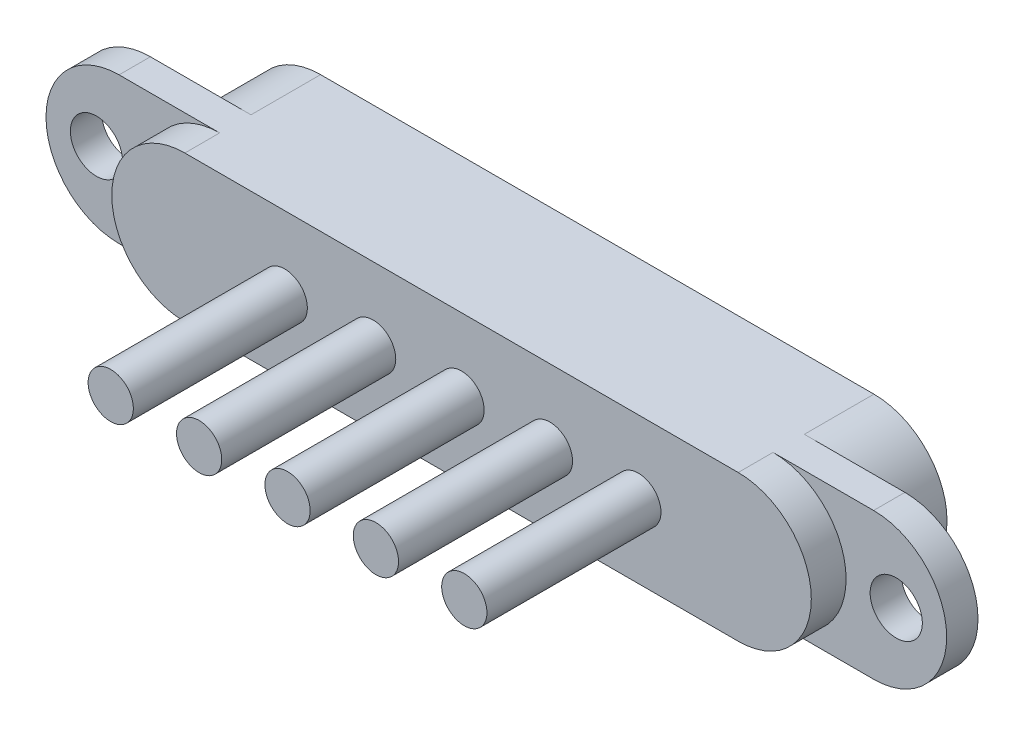
ISO-10303-21;
HEADER;
FILE_DESCRIPTION(('STEP AP214'),'2;1');
FILE_NAME('part.step','',(''),(''),'','','');
FILE_SCHEMA(('AUTOMOTIVE_DESIGN { 1 0 10303 214 1 1 1 1 }'));
ENDSEC;
DATA;
#1=APPLICATION_CONTEXT('core data for automotive mechanical design processes');
#2=APPLICATION_PROTOCOL_DEFINITION('international standard','automotive_design',2000,#1);
#3=PRODUCT_CONTEXT('',#1,'mechanical');
#4=PRODUCT('Part','Part','',(#3));
#5=PRODUCT_RELATED_PRODUCT_CATEGORY('part','',(#4));
#6=PRODUCT_DEFINITION_FORMATION('','',#4);
#7=PRODUCT_DEFINITION_CONTEXT('part definition',#1,'design');
#8=PRODUCT_DEFINITION('design','',#6,#7);
#9=PRODUCT_DEFINITION_SHAPE('','',#8);
#10=(LENGTH_UNIT() NAMED_UNIT(*) SI_UNIT(.MILLI.,.METRE.));
#11=(NAMED_UNIT(*) PLANE_ANGLE_UNIT() SI_UNIT($,.RADIAN.));
#12=(NAMED_UNIT(*) SI_UNIT($,.STERADIAN.) SOLID_ANGLE_UNIT());
#13=UNCERTAINTY_MEASURE_WITH_UNIT(LENGTH_MEASURE(1.E-05),#10,'distance_accuracy_value','');
#14=(GEOMETRIC_REPRESENTATION_CONTEXT(3) GLOBAL_UNCERTAINTY_ASSIGNED_CONTEXT((#13)) GLOBAL_UNIT_ASSIGNED_CONTEXT((#10,
#11,#12)) REPRESENTATION_CONTEXT('',''));
#15=CARTESIAN_POINT('',(0.,0.,0.));
#16=DIRECTION('',(0.,0.,1.));
#17=DIRECTION('',(1.,0.,0.));
#18=AXIS2_PLACEMENT_3D('',#15,#16,#17);
#19=CARTESIAN_POINT('',(-10.84,0.,2.9));
#20=DIRECTION('',(0.,0.,1.));
#21=DIRECTION('',(1.,0.,0.));
#22=AXIS2_PLACEMENT_3D('',#19,#20,#21);
#23=PLANE('',#22);
#24=CARTESIAN_POINT('',(-7.95,0.,2.9));
#25=DIRECTION('',(0.,0.,1.));
#26=DIRECTION('',(1.,0.,0.));
#27=AXIS2_PLACEMENT_3D('',#24,#25,#26);
#28=CIRCLE('',#27,2.1);
#29=CARTESIAN_POINT('',(-7.95,2.1,2.9));
#30=VERTEX_POINT('',#29);
#31=CARTESIAN_POINT('',(-7.95,-2.1,2.9));
#32=VERTEX_POINT('',#31);
#33=EDGE_CURVE('E58',#30,#32,#28,.T.);
#34=ORIENTED_EDGE('',*,*,#33,.F.);
#35=DIRECTION('',(-1.,0.,0.));
#36=VECTOR('',#35,1.);
#37=CARTESIAN_POINT('',(-10.84,2.1,2.9));
#38=LINE('',#37,#36);
#39=CARTESIAN_POINT('',(-10.84,2.1,2.9));
#40=VERTEX_POINT('',#39);
#41=EDGE_CURVE('E238',#30,#40,#38,.T.);
#42=ORIENTED_EDGE('',*,*,#41,.T.);
#43=CARTESIAN_POINT('',(-10.84,0.,2.9));
#44=DIRECTION('',(0.,0.,1.));
#45=DIRECTION('',(1.,0.,0.));
#46=AXIS2_PLACEMENT_3D('',#43,#44,#45);
#47=CIRCLE('',#46,2.1);
#48=CARTESIAN_POINT('',(-10.84,-2.1,2.9));
#49=VERTEX_POINT('',#48);
#50=EDGE_CURVE('E232',#40,#49,#47,.T.);
#51=ORIENTED_EDGE('',*,*,#50,.T.);
#52=DIRECTION('',(1.,0.,0.));
#53=VECTOR('',#52,1.);
#54=CARTESIAN_POINT('',(-10.84,-2.1,2.9));
#55=LINE('',#54,#53);
#56=EDGE_CURVE('E237',#49,#32,#55,.T.);
#57=ORIENTED_EDGE('',*,*,#56,.T.);
#58=EDGE_LOOP('',(#34,#42,#51,#57));
#59=FACE_BOUND('',#58,.T.);
#60=CARTESIAN_POINT('',(-11.49,0.,2.9));
#61=DIRECTION('',(0.,0.,-1.));
#62=DIRECTION('',(-1.,0.,0.));
#63=AXIS2_PLACEMENT_3D('',#60,#61,#62);
#64=CIRCLE('',#63,0.75);
#65=CARTESIAN_POINT('',(-12.24,0.,2.9));
#66=VERTEX_POINT('',#65);
#67=EDGE_CURVE('E214',#66,#66,#64,.T.);
#68=ORIENTED_EDGE('',*,*,#67,.T.);
#69=EDGE_LOOP('',(#68));
#70=FACE_BOUND('',#69,.T.);
#71=ADVANCED_FACE('F43',(#59,#70),#23,.T.);
#72=CARTESIAN_POINT('',(-7.95,0.,2.));
#73=DIRECTION('',(0.,0.,-1.));
#74=DIRECTION('',(-1.,0.,0.));
#75=AXIS2_PLACEMENT_3D('',#72,#73,#74);
#76=CYLINDRICAL_SURFACE('',#75,2.1);
#77=CARTESIAN_POINT('',(-7.95,0.,0.));
#78=DIRECTION('',(0.,0.,1.));
#79=DIRECTION('',(1.,0.,0.));
#80=AXIS2_PLACEMENT_3D('',#77,#78,#79);
#81=CIRCLE('',#80,2.1);
#82=CARTESIAN_POINT('',(-7.95,2.1,0.));
#83=VERTEX_POINT('',#82);
#84=CARTESIAN_POINT('',(-7.95,-2.1,0.));
#85=VERTEX_POINT('',#84);
#86=EDGE_CURVE('E266',#83,#85,#81,.T.);
#87=ORIENTED_EDGE('',*,*,#86,.T.);
#88=DIRECTION('',(0.,0.,-1.));
#89=VECTOR('',#88,1.);
#90=CARTESIAN_POINT('',(-7.95,-2.1,2.));
#91=LINE('',#90,#89);
#92=CARTESIAN_POINT('',(-7.95,-2.1,2.));
#93=VERTEX_POINT('',#92);
#94=EDGE_CURVE('E50',#93,#85,#91,.T.);
#95=ORIENTED_EDGE('',*,*,#94,.F.);
#96=CARTESIAN_POINT('',(-7.95,0.,2.));
#97=DIRECTION('',(0.,0.,1.));
#98=DIRECTION('',(1.,0.,0.));
#99=AXIS2_PLACEMENT_3D('',#96,#97,#98);
#100=CIRCLE('',#99,2.1);
#101=CARTESIAN_POINT('',(-7.95,2.1,2.));
#102=VERTEX_POINT('',#101);
#103=EDGE_CURVE('E270',#102,#93,#100,.T.);
#104=ORIENTED_EDGE('',*,*,#103,.F.);
#105=DIRECTION('',(0.,0.,-1.));
#106=VECTOR('',#105,1.);
#107=CARTESIAN_POINT('',(-7.95,2.1,2.));
#108=LINE('',#107,#106);
#109=EDGE_CURVE('E274',#102,#83,#108,.T.);
#110=ORIENTED_EDGE('',*,*,#109,.T.);
#111=EDGE_LOOP('',(#87,#95,#104,#110));
#112=FACE_BOUND('',#111,.T.);
#113=ADVANCED_FACE('F44',(#112),#76,.T.);
#114=CARTESIAN_POINT('',(-7.95,-2.1,2.));
#115=DIRECTION('',(0.,1.,0.));
#116=DIRECTION('',(0.,0.,1.));
#117=AXIS2_PLACEMENT_3D('',#114,#115,#116);
#118=PLANE('',#117);
#119=DIRECTION('',(1.,0.,0.));
#120=VECTOR('',#119,1.);
#121=CARTESIAN_POINT('',(-7.95,-2.1,0.));
#122=LINE('',#121,#120);
#123=CARTESIAN_POINT('',(7.95,-2.1,0.));
#124=VERTEX_POINT('',#123);
#125=EDGE_CURVE('E279',#85,#124,#122,.T.);
#126=ORIENTED_EDGE('',*,*,#125,.T.);
#127=DIRECTION('',(0.,0.,-1.));
#128=VECTOR('',#127,1.);
#129=CARTESIAN_POINT('',(7.95,-2.1,2.));
#130=LINE('',#129,#128);
#131=CARTESIAN_POINT('',(7.95,-2.1,2.));
#132=VERTEX_POINT('',#131);
#133=EDGE_CURVE('E292',#132,#124,#130,.T.);
#134=ORIENTED_EDGE('',*,*,#133,.F.);
#135=DIRECTION('',(1.,0.,0.));
#136=VECTOR('',#135,1.);
#137=CARTESIAN_POINT('',(-10.84,-2.1,2.));
#138=LINE('',#137,#136);
#139=CARTESIAN_POINT('',(10.84,-2.1,2.));
#140=VERTEX_POINT('',#139);
#141=EDGE_CURVE('E247',#132,#140,#138,.T.);
#142=ORIENTED_EDGE('',*,*,#141,.T.);
#143=DIRECTION('',(0.,0.,-1.));
#144=VECTOR('',#143,1.);
#145=CARTESIAN_POINT('',(10.84,-2.1,2.9));
#146=LINE('',#145,#144);
#147=CARTESIAN_POINT('',(10.84,-2.1,2.9));
#148=VERTEX_POINT('',#147);
#149=EDGE_CURVE('E257',#148,#140,#146,.T.);
#150=ORIENTED_EDGE('',*,*,#149,.F.);
#151=CARTESIAN_POINT('',(7.95,-2.1,2.9));
#152=VERTEX_POINT('',#151);
#153=EDGE_CURVE('E231',#152,#148,#55,.T.);
#154=ORIENTED_EDGE('',*,*,#153,.F.);
#155=DIRECTION('',(0.,0.,-1.));
#156=VECTOR('',#155,1.);
#157=CARTESIAN_POINT('',(7.95,-2.1,3.9));
#158=LINE('',#157,#156);
#159=CARTESIAN_POINT('',(7.95,-2.1,3.9));
#160=VERTEX_POINT('',#159);
#161=EDGE_CURVE('E141',#160,#152,#158,.T.);
#162=ORIENTED_EDGE('',*,*,#161,.F.);
#163=DIRECTION('',(1.,0.,0.));
#164=VECTOR('',#163,1.);
#165=CARTESIAN_POINT('',(-7.95,-2.1,3.9));
#166=LINE('',#165,#164);
#167=CARTESIAN_POINT('',(-7.95,-2.1,3.9));
#168=VERTEX_POINT('',#167);
#169=EDGE_CURVE('E140',#168,#160,#166,.T.);
#170=ORIENTED_EDGE('',*,*,#169,.F.);
#171=DIRECTION('',(0.,0.,-1.));
#172=VECTOR('',#171,1.);
#173=CARTESIAN_POINT('',(-7.95,-2.1,3.9));
#174=LINE('',#173,#172);
#175=EDGE_CURVE('E143',#168,#32,#174,.T.);
#176=ORIENTED_EDGE('',*,*,#175,.T.);
#177=ORIENTED_EDGE('',*,*,#56,.F.);
#178=DIRECTION('',(0.,0.,-1.));
#179=VECTOR('',#178,1.);
#180=CARTESIAN_POINT('',(-10.84,-2.1,2.9));
#181=LINE('',#180,#179);
#182=CARTESIAN_POINT('',(-10.84,-2.1,2.));
#183=VERTEX_POINT('',#182);
#184=EDGE_CURVE('E263',#49,#183,#181,.T.);
#185=ORIENTED_EDGE('',*,*,#184,.T.);
#186=EDGE_CURVE('E250',#183,#93,#138,.T.);
#187=ORIENTED_EDGE('',*,*,#186,.T.);
#188=ORIENTED_EDGE('',*,*,#94,.T.);
#189=EDGE_LOOP('',(#126,#134,#142,#150,#154,#162,#170,#176,#177,#185,#187,#188));
#190=FACE_BOUND('',#189,.T.);
#191=ADVANCED_FACE('F136',(#190),#118,.F.);
#192=CARTESIAN_POINT('',(7.95,0.,2.));
#193=DIRECTION('',(0.,0.,-1.));
#194=DIRECTION('',(-1.,0.,0.));
#195=AXIS2_PLACEMENT_3D('',#192,#193,#194);
#196=CYLINDRICAL_SURFACE('',#195,2.1);
#197=CARTESIAN_POINT('',(7.95,0.,0.));
#198=DIRECTION('',(0.,0.,1.));
#199=DIRECTION('',(1.,0.,0.));
#200=AXIS2_PLACEMENT_3D('',#197,#198,#199);
#201=CIRCLE('',#200,2.1);
#202=CARTESIAN_POINT('',(7.95,2.1,0.));
#203=VERTEX_POINT('',#202);
#204=EDGE_CURVE('E281',#124,#203,#201,.T.);
#205=ORIENTED_EDGE('',*,*,#204,.T.);
#206=DIRECTION('',(0.,0.,-1.));
#207=VECTOR('',#206,1.);
#208=CARTESIAN_POINT('',(7.95,2.1,2.));
#209=LINE('',#208,#207);
#210=CARTESIAN_POINT('',(7.95,2.10000000000001,2.));
#211=VERTEX_POINT('',#210);
#212=EDGE_CURVE('E289',#211,#203,#209,.T.);
#213=ORIENTED_EDGE('',*,*,#212,.F.);
#214=CARTESIAN_POINT('',(7.95,0.,2.));
#215=DIRECTION('',(0.,0.,1.));
#216=DIRECTION('',(1.,0.,0.));
#217=AXIS2_PLACEMENT_3D('',#214,#215,#216);
#218=CIRCLE('',#217,2.1);
#219=EDGE_CURVE('E269',#132,#211,#218,.T.);
#220=ORIENTED_EDGE('',*,*,#219,.F.);
#221=ORIENTED_EDGE('',*,*,#133,.T.);
#222=EDGE_LOOP('',(#205,#213,#220,#221));
#223=FACE_BOUND('',#222,.T.);
#224=ADVANCED_FACE('F410',(#223),#196,.T.);
#225=CARTESIAN_POINT('',(-7.95,2.1,2.));
#226=DIRECTION('',(0.,-1.,0.));
#227=DIRECTION('',(0.,0.,-1.));
#228=AXIS2_PLACEMENT_3D('',#225,#226,#227);
#229=PLANE('',#228);
#230=DIRECTION('',(-1.,0.,0.));
#231=VECTOR('',#230,1.);
#232=CARTESIAN_POINT('',(-7.95,2.1,0.));
#233=LINE('',#232,#231);
#234=EDGE_CURVE('E271',#203,#83,#233,.T.);
#235=ORIENTED_EDGE('',*,*,#234,.T.);
#236=ORIENTED_EDGE('',*,*,#109,.F.);
#237=DIRECTION('',(-1.,0.,0.));
#238=VECTOR('',#237,1.);
#239=CARTESIAN_POINT('',(-10.84,2.1,2.));
#240=LINE('',#239,#238);
#241=CARTESIAN_POINT('',(-10.84,2.1,2.));
#242=VERTEX_POINT('',#241);
#243=EDGE_CURVE('E252',#102,#242,#240,.T.);
#244=ORIENTED_EDGE('',*,*,#243,.T.);
#245=DIRECTION('',(0.,0.,-1.));
#246=VECTOR('',#245,1.);
#247=CARTESIAN_POINT('',(-10.84,2.1,2.9));
#248=LINE('',#247,#246);
#249=EDGE_CURVE('E242',#40,#242,#248,.T.);
#250=ORIENTED_EDGE('',*,*,#249,.F.);
#251=ORIENTED_EDGE('',*,*,#41,.F.);
#252=DIRECTION('',(0.,0.,-1.));
#253=VECTOR('',#252,1.);
#254=CARTESIAN_POINT('',(-7.95,2.1,3.9));
#255=LINE('',#254,#253);
#256=CARTESIAN_POINT('',(-7.95,2.1,3.9));
#257=VERTEX_POINT('',#256);
#258=EDGE_CURVE('E317',#257,#30,#255,.T.);
#259=ORIENTED_EDGE('',*,*,#258,.F.);
#260=DIRECTION('',(-1.,0.,0.));
#261=VECTOR('',#260,1.);
#262=CARTESIAN_POINT('',(7.95,2.1,3.9));
#263=LINE('',#262,#261);
#264=CARTESIAN_POINT('',(7.95,2.1,3.9));
#265=VERTEX_POINT('',#264);
#266=EDGE_CURVE('E153',#265,#257,#263,.T.);
#267=ORIENTED_EDGE('',*,*,#266,.F.);
#268=DIRECTION('',(0.,0.,-1.));
#269=VECTOR('',#268,1.);
#270=CARTESIAN_POINT('',(7.95,2.1,3.9));
#271=LINE('',#270,#269);
#272=CARTESIAN_POINT('',(7.95,2.1,2.9));
#273=VERTEX_POINT('',#272);
#274=EDGE_CURVE('E163',#265,#273,#271,.T.);
#275=ORIENTED_EDGE('',*,*,#274,.T.);
#276=CARTESIAN_POINT('',(10.84,2.10000000000001,2.9));
#277=VERTEX_POINT('',#276);
#278=EDGE_CURVE('E241',#277,#273,#38,.T.);
#279=ORIENTED_EDGE('',*,*,#278,.F.);
#280=DIRECTION('',(0.,0.,-1.));
#281=VECTOR('',#280,1.);
#282=CARTESIAN_POINT('',(10.84,2.10000000000001,2.9));
#283=LINE('',#282,#281);
#284=CARTESIAN_POINT('',(10.84,2.10000000000001,2.));
#285=VERTEX_POINT('',#284);
#286=EDGE_CURVE('E260',#277,#285,#283,.T.);
#287=ORIENTED_EDGE('',*,*,#286,.T.);
#288=EDGE_CURVE('E233',#285,#211,#240,.T.);
#289=ORIENTED_EDGE('',*,*,#288,.T.);
#290=ORIENTED_EDGE('',*,*,#212,.T.);
#291=EDGE_LOOP('',(#235,#236,#244,#250,#251,#259,#267,#275,#279,#287,#289,#290));
#292=FACE_BOUND('',#291,.T.);
#293=ADVANCED_FACE('F330',(#292),#229,.F.);
#294=CARTESIAN_POINT('',(-7.95,0.,0.));
#295=DIRECTION('',(0.,0.,1.));
#296=DIRECTION('',(1.,0.,0.));
#297=AXIS2_PLACEMENT_3D('',#294,#295,#296);
#298=PLANE('',#297);
#299=CARTESIAN_POINT('',(-2.54,0.,0.));
#300=DIRECTION('',(0.,0.,-1.));
#301=DIRECTION('',(-1.,0.,0.));
#302=AXIS2_PLACEMENT_3D('',#299,#300,#301);
#303=CIRCLE('',#302,0.65);
#304=CARTESIAN_POINT('',(-3.19,0.,0.));
#305=VERTEX_POINT('',#304);
#306=EDGE_CURVE('E176',#305,#305,#303,.T.);
#307=ORIENTED_EDGE('',*,*,#306,.F.);
#308=EDGE_LOOP('',(#307));
#309=FACE_BOUND('',#308,.T.);
#310=CARTESIAN_POINT('',(-5.08,0.,0.));
#311=DIRECTION('',(0.,0.,-1.));
#312=DIRECTION('',(-1.,0.,0.));
#313=AXIS2_PLACEMENT_3D('',#310,#311,#312);
#314=CIRCLE('',#313,0.65);
#315=CARTESIAN_POINT('',(-5.73,0.,0.));
#316=VERTEX_POINT('',#315);
#317=EDGE_CURVE('E187',#316,#316,#314,.T.);
#318=ORIENTED_EDGE('',*,*,#317,.F.);
#319=EDGE_LOOP('',(#318));
#320=FACE_BOUND('',#319,.T.);
#321=CARTESIAN_POINT('',(2.54,0.,0.));
#322=DIRECTION('',(0.,0.,-1.));
#323=DIRECTION('',(-1.,0.,0.));
#324=AXIS2_PLACEMENT_3D('',#321,#322,#323);
#325=CIRCLE('',#324,0.65);
#326=CARTESIAN_POINT('',(1.89,0.,0.));
#327=VERTEX_POINT('',#326);
#328=EDGE_CURVE('E198',#327,#327,#325,.T.);
#329=ORIENTED_EDGE('',*,*,#328,.F.);
#330=EDGE_LOOP('',(#329));
#331=FACE_BOUND('',#330,.T.);
#332=CARTESIAN_POINT('',(5.08,0.,0.));
#333=DIRECTION('',(0.,0.,-1.));
#334=DIRECTION('',(-1.,0.,0.));
#335=AXIS2_PLACEMENT_3D('',#332,#333,#334);
#336=CIRCLE('',#335,0.65);
#337=CARTESIAN_POINT('',(4.43,0.,0.));
#338=VERTEX_POINT('',#337);
#339=EDGE_CURVE('E204',#338,#338,#336,.T.);
#340=ORIENTED_EDGE('',*,*,#339,.F.);
#341=EDGE_LOOP('',(#340));
#342=FACE_BOUND('',#341,.T.);
#343=CARTESIAN_POINT('',(8.,0.,0.));
#344=DIRECTION('',(0.,0.,-1.));
#345=DIRECTION('',(-1.,0.,0.));
#346=AXIS2_PLACEMENT_3D('',#343,#344,#345);
#347=CIRCLE('',#346,1.5);
#348=CARTESIAN_POINT('',(6.5,0.,0.));
#349=VERTEX_POINT('',#348);
#350=EDGE_CURVE('E169',#349,#349,#347,.T.);
#351=ORIENTED_EDGE('',*,*,#350,.F.);
#352=EDGE_LOOP('',(#351));
#353=FACE_BOUND('',#352,.T.);
#354=CARTESIAN_POINT('',(-8.,0.,0.));
#355=DIRECTION('',(0.,0.,-1.));
#356=DIRECTION('',(-1.,0.,0.));
#357=AXIS2_PLACEMENT_3D('',#354,#355,#356);
#358=CIRCLE('',#357,1.5);
#359=CARTESIAN_POINT('',(-9.5,0.,0.));
#360=VERTEX_POINT('',#359);
#361=EDGE_CURVE('E165',#360,#360,#358,.T.);
#362=ORIENTED_EDGE('',*,*,#361,.F.);
#363=EDGE_LOOP('',(#362));
#364=FACE_BOUND('',#363,.T.);
#365=CARTESIAN_POINT('',(0.,0.,0.));
#366=DIRECTION('',(0.,0.,-1.));
#367=DIRECTION('',(-1.,0.,0.));
#368=AXIS2_PLACEMENT_3D('',#365,#366,#367);
#369=CIRCLE('',#368,0.65);
#370=CARTESIAN_POINT('',(-0.65,0.,0.));
#371=VERTEX_POINT('',#370);
#372=EDGE_CURVE('E181',#371,#371,#369,.T.);
#373=ORIENTED_EDGE('',*,*,#372,.F.);
#374=EDGE_LOOP('',(#373));
#375=FACE_BOUND('',#374,.T.);
#376=ORIENTED_EDGE('',*,*,#86,.F.);
#377=ORIENTED_EDGE('',*,*,#234,.F.);
#378=ORIENTED_EDGE('',*,*,#204,.F.);
#379=ORIENTED_EDGE('',*,*,#125,.F.);
#380=EDGE_LOOP('',(#376,#377,#378,#379));
#381=FACE_BOUND('',#380,.T.);
#382=ADVANCED_FACE('F387',(#309,#320,#331,#342,#353,#364,#375,#381),#298,.F.);
#383=CARTESIAN_POINT('',(-10.84,0.,2.));
#384=DIRECTION('',(0.,0.,1.));
#385=DIRECTION('',(1.,0.,0.));
#386=AXIS2_PLACEMENT_3D('',#383,#384,#385);
#387=PLANE('',#386);
#388=CARTESIAN_POINT('',(-11.49,0.,2.));
#389=DIRECTION('',(0.,0.,-1.));
#390=DIRECTION('',(-1.,0.,0.));
#391=AXIS2_PLACEMENT_3D('',#388,#389,#390);
#392=CIRCLE('',#391,0.75);
#393=CARTESIAN_POINT('',(-12.24,0.,2.));
#394=VERTEX_POINT('',#393);
#395=EDGE_CURVE('E226',#394,#394,#392,.T.);
#396=ORIENTED_EDGE('',*,*,#395,.F.);
#397=EDGE_LOOP('',(#396));
#398=FACE_BOUND('',#397,.T.);
#399=ORIENTED_EDGE('',*,*,#243,.F.);
#400=ORIENTED_EDGE('',*,*,#103,.T.);
#401=ORIENTED_EDGE('',*,*,#186,.F.);
#402=CARTESIAN_POINT('',(-10.84,0.,2.));
#403=DIRECTION('',(0.,0.,1.));
#404=DIRECTION('',(1.,0.,0.));
#405=AXIS2_PLACEMENT_3D('',#402,#403,#404);
#406=CIRCLE('',#405,2.1);
#407=EDGE_CURVE('E225',#242,#183,#406,.T.);
#408=ORIENTED_EDGE('',*,*,#407,.F.);
#409=EDGE_LOOP('',(#399,#400,#401,#408));
#410=FACE_BOUND('',#409,.T.);
#411=ADVANCED_FACE('F362',(#398,#410),#387,.F.);
#412=CARTESIAN_POINT('',(-10.84,0.,2.9));
#413=DIRECTION('',(0.,0.,-1.));
#414=DIRECTION('',(-1.,0.,0.));
#415=AXIS2_PLACEMENT_3D('',#412,#413,#414);
#416=CYLINDRICAL_SURFACE('',#415,2.1);
#417=ORIENTED_EDGE('',*,*,#407,.T.);
#418=ORIENTED_EDGE('',*,*,#184,.F.);
#419=ORIENTED_EDGE('',*,*,#50,.F.);
#420=ORIENTED_EDGE('',*,*,#249,.T.);
#421=EDGE_LOOP('',(#417,#418,#419,#420));
#422=FACE_BOUND('',#421,.T.);
#423=ADVANCED_FACE('F365',(#422),#416,.T.);
#424=CARTESIAN_POINT('',(10.84,0.,2.9));
#425=DIRECTION('',(0.,0.,-1.));
#426=DIRECTION('',(-1.,0.,0.));
#427=AXIS2_PLACEMENT_3D('',#424,#425,#426);
#428=CYLINDRICAL_SURFACE('',#427,2.1);
#429=CARTESIAN_POINT('',(10.84,0.,2.));
#430=DIRECTION('',(0.,0.,1.));
#431=DIRECTION('',(1.,0.,0.));
#432=AXIS2_PLACEMENT_3D('',#429,#430,#431);
#433=CIRCLE('',#432,2.1);
#434=EDGE_CURVE('E248',#140,#285,#433,.T.);
#435=ORIENTED_EDGE('',*,*,#434,.T.);
#436=ORIENTED_EDGE('',*,*,#286,.F.);
#437=CARTESIAN_POINT('',(10.84,0.,2.9));
#438=DIRECTION('',(0.,0.,1.));
#439=DIRECTION('',(1.,0.,0.));
#440=AXIS2_PLACEMENT_3D('',#437,#438,#439);
#441=CIRCLE('',#440,2.1);
#442=EDGE_CURVE('E236',#148,#277,#441,.T.);
#443=ORIENTED_EDGE('',*,*,#442,.F.);
#444=ORIENTED_EDGE('',*,*,#149,.T.);
#445=EDGE_LOOP('',(#435,#436,#443,#444));
#446=FACE_BOUND('',#445,.T.);
#447=ADVANCED_FACE('F354',(#446),#428,.T.);
#448=CARTESIAN_POINT('',(7.95,0.,2.9));
#449=DIRECTION('',(0.,0.,1.));
#450=DIRECTION('',(1.,0.,0.));
#451=AXIS2_PLACEMENT_3D('',#448,#449,#450);
#452=CIRCLE('',#451,2.1);
#453=EDGE_CURVE('E69',#152,#273,#452,.T.);
#454=ORIENTED_EDGE('',*,*,#453,.F.);
#455=ORIENTED_EDGE('',*,*,#153,.T.);
#456=ORIENTED_EDGE('',*,*,#442,.T.);
#457=ORIENTED_EDGE('',*,*,#278,.T.);
#458=EDGE_LOOP('',(#454,#455,#456,#457));
#459=FACE_BOUND('',#458,.T.);
#460=CARTESIAN_POINT('',(11.49,0.,2.9));
#461=DIRECTION('',(0.,0.,-1.));
#462=DIRECTION('',(-1.,0.,0.));
#463=AXIS2_PLACEMENT_3D('',#460,#461,#462);
#464=CIRCLE('',#463,0.75);
#465=CARTESIAN_POINT('',(10.74,0.,2.9));
#466=VERTEX_POINT('',#465);
#467=EDGE_CURVE('E218',#466,#466,#464,.T.);
#468=ORIENTED_EDGE('',*,*,#467,.T.);
#469=EDGE_LOOP('',(#468));
#470=FACE_BOUND('',#469,.T.);
#471=ADVANCED_FACE('F344',(#459,#470),#23,.T.);
#472=CARTESIAN_POINT('',(11.49,0.,2.));
#473=DIRECTION('',(0.,0.,-1.));
#474=DIRECTION('',(-1.,0.,0.));
#475=AXIS2_PLACEMENT_3D('',#472,#473,#474);
#476=CIRCLE('',#475,0.75);
#477=CARTESIAN_POINT('',(10.74,0.,2.));
#478=VERTEX_POINT('',#477);
#479=EDGE_CURVE('E224',#478,#478,#476,.T.);
#480=ORIENTED_EDGE('',*,*,#479,.F.);
#481=EDGE_LOOP('',(#480));
#482=FACE_BOUND('',#481,.T.);
#483=ORIENTED_EDGE('',*,*,#141,.F.);
#484=ORIENTED_EDGE('',*,*,#219,.T.);
#485=ORIENTED_EDGE('',*,*,#288,.F.);
#486=ORIENTED_EDGE('',*,*,#434,.F.);
#487=EDGE_LOOP('',(#483,#484,#485,#486));
#488=FACE_BOUND('',#487,.T.);
#489=ADVANCED_FACE('F353',(#482,#488),#387,.F.);
#490=CARTESIAN_POINT('',(11.49,0.,2.9));
#491=DIRECTION('',(0.,0.,-1.));
#492=DIRECTION('',(-1.,0.,0.));
#493=AXIS2_PLACEMENT_3D('',#490,#491,#492);
#494=CYLINDRICAL_SURFACE('',#493,0.75);
#495=ORIENTED_EDGE('',*,*,#467,.F.);
#496=EDGE_LOOP('',(#495));
#497=FACE_BOUND('',#496,.T.);
#498=ORIENTED_EDGE('',*,*,#479,.T.);
#499=EDGE_LOOP('',(#498));
#500=FACE_BOUND('',#499,.T.);
#501=ADVANCED_FACE('F358',(#497,#500),#494,.F.);
#502=CARTESIAN_POINT('',(-11.49,0.,2.9));
#503=DIRECTION('',(0.,0.,-1.));
#504=DIRECTION('',(-1.,0.,0.));
#505=AXIS2_PLACEMENT_3D('',#502,#503,#504);
#506=CYLINDRICAL_SURFACE('',#505,0.75);
#507=ORIENTED_EDGE('',*,*,#67,.F.);
#508=EDGE_LOOP('',(#507));
#509=FACE_BOUND('',#508,.T.);
#510=ORIENTED_EDGE('',*,*,#395,.T.);
#511=EDGE_LOOP('',(#510));
#512=FACE_BOUND('',#511,.T.);
#513=ADVANCED_FACE('F375',(#509,#512),#506,.F.);
#514=CARTESIAN_POINT('',(0.,0.,0.1));
#515=DIRECTION('',(0.,0.,-1.));
#516=DIRECTION('',(-1.,0.,0.));
#517=AXIS2_PLACEMENT_3D('',#514,#515,#516);
#518=CYLINDRICAL_SURFACE('',#517,0.65);
#519=CARTESIAN_POINT('',(0.,0.,0.1));
#520=DIRECTION('',(0.,0.,-1.));
#521=DIRECTION('',(-1.,0.,0.));
#522=AXIS2_PLACEMENT_3D('',#519,#520,#521);
#523=CIRCLE('',#522,0.65);
#524=CARTESIAN_POINT('',(-0.65,0.,0.1));
#525=VERTEX_POINT('',#524);
#526=EDGE_CURVE('E211',#525,#525,#523,.T.);
#527=ORIENTED_EDGE('',*,*,#526,.F.);
#528=EDGE_LOOP('',(#527));
#529=FACE_BOUND('',#528,.T.);
#530=ORIENTED_EDGE('',*,*,#372,.T.);
#531=EDGE_LOOP('',(#530));
#532=FACE_BOUND('',#531,.T.);
#533=ADVANCED_FACE('F683',(#529,#532),#518,.F.);
#534=CARTESIAN_POINT('',(0.,0.,0.1));
#535=DIRECTION('',(0.,0.,-1.));
#536=DIRECTION('',(-1.,0.,0.));
#537=AXIS2_PLACEMENT_3D('',#534,#535,#536);
#538=PLANE('',#537);
#539=ORIENTED_EDGE('',*,*,#526,.T.);
#540=EDGE_LOOP('',(#539));
#541=FACE_BOUND('',#540,.T.);
#542=ADVANCED_FACE('F673',(#541),#538,.T.);
#543=CARTESIAN_POINT('',(-8.,0.,0.1));
#544=DIRECTION('',(0.,0.,-1.));
#545=DIRECTION('',(-1.,0.,0.));
#546=AXIS2_PLACEMENT_3D('',#543,#544,#545);
#547=CYLINDRICAL_SURFACE('',#546,1.5);
#548=CARTESIAN_POINT('',(-8.,0.,0.1));
#549=DIRECTION('',(0.,0.,-1.));
#550=DIRECTION('',(-1.,0.,0.));
#551=AXIS2_PLACEMENT_3D('',#548,#549,#550);
#552=CIRCLE('',#551,1.5);
#553=CARTESIAN_POINT('',(-9.5,0.,0.1));
#554=VERTEX_POINT('',#553);
#555=EDGE_CURVE('E157',#554,#554,#552,.T.);
#556=ORIENTED_EDGE('',*,*,#555,.F.);
#557=EDGE_LOOP('',(#556));
#558=FACE_BOUND('',#557,.T.);
#559=ORIENTED_EDGE('',*,*,#361,.T.);
#560=EDGE_LOOP('',(#559));
#561=FACE_BOUND('',#560,.T.);
#562=ADVANCED_FACE('F666',(#558,#561),#547,.F.);
#563=CARTESIAN_POINT('',(-8.,0.,0.1));
#564=DIRECTION('',(0.,0.,-1.));
#565=DIRECTION('',(-1.,0.,0.));
#566=AXIS2_PLACEMENT_3D('',#563,#564,#565);
#567=PLANE('',#566);
#568=ORIENTED_EDGE('',*,*,#555,.T.);
#569=EDGE_LOOP('',(#568));
#570=FACE_BOUND('',#569,.T.);
#571=ADVANCED_FACE('F660',(#570),#567,.T.);
#572=CARTESIAN_POINT('',(8.,0.,0.1));
#573=DIRECTION('',(0.,0.,-1.));
#574=DIRECTION('',(-1.,0.,0.));
#575=AXIS2_PLACEMENT_3D('',#572,#573,#574);
#576=CYLINDRICAL_SURFACE('',#575,1.5);
#577=CARTESIAN_POINT('',(8.,0.,0.1));
#578=DIRECTION('',(0.,0.,-1.));
#579=DIRECTION('',(-1.,0.,0.));
#580=AXIS2_PLACEMENT_3D('',#577,#578,#579);
#581=CIRCLE('',#580,1.5);
#582=CARTESIAN_POINT('',(6.5,0.,0.1));
#583=VERTEX_POINT('',#582);
#584=EDGE_CURVE('E172',#583,#583,#581,.T.);
#585=ORIENTED_EDGE('',*,*,#584,.F.);
#586=EDGE_LOOP('',(#585));
#587=FACE_BOUND('',#586,.T.);
#588=ORIENTED_EDGE('',*,*,#350,.T.);
#589=EDGE_LOOP('',(#588));
#590=FACE_BOUND('',#589,.T.);
#591=ADVANCED_FACE('F648',(#587,#590),#576,.F.);
#592=CARTESIAN_POINT('',(8.,0.,0.1));
#593=DIRECTION('',(0.,0.,-1.));
#594=DIRECTION('',(-1.,0.,0.));
#595=AXIS2_PLACEMENT_3D('',#592,#593,#594);
#596=PLANE('',#595);
#597=ORIENTED_EDGE('',*,*,#584,.T.);
#598=EDGE_LOOP('',(#597));
#599=FACE_BOUND('',#598,.T.);
#600=ADVANCED_FACE('F640',(#599),#596,.T.);
#601=CARTESIAN_POINT('',(5.08,0.,0.1));
#602=DIRECTION('',(0.,0.,-1.));
#603=DIRECTION('',(-1.,0.,0.));
#604=AXIS2_PLACEMENT_3D('',#601,#602,#603);
#605=CYLINDRICAL_SURFACE('',#604,0.65);
#606=CARTESIAN_POINT('',(5.08,0.,0.1));
#607=DIRECTION('',(0.,0.,-1.));
#608=DIRECTION('',(-1.,0.,0.));
#609=AXIS2_PLACEMENT_3D('',#606,#607,#608);
#610=CIRCLE('',#609,0.65);
#611=CARTESIAN_POINT('',(4.43,0.,0.1));
#612=VERTEX_POINT('',#611);
#613=EDGE_CURVE('E175',#612,#612,#610,.T.);
#614=ORIENTED_EDGE('',*,*,#613,.F.);
#615=EDGE_LOOP('',(#614));
#616=FACE_BOUND('',#615,.T.);
#617=ORIENTED_EDGE('',*,*,#339,.T.);
#618=EDGE_LOOP('',(#617));
#619=FACE_BOUND('',#618,.T.);
#620=ADVANCED_FACE('F629',(#616,#619),#605,.F.);
#621=CARTESIAN_POINT('',(5.08,0.,0.1));
#622=DIRECTION('',(0.,0.,-1.));
#623=DIRECTION('',(-1.,0.,0.));
#624=AXIS2_PLACEMENT_3D('',#621,#622,#623);
#625=PLANE('',#624);
#626=ORIENTED_EDGE('',*,*,#613,.T.);
#627=EDGE_LOOP('',(#626));
#628=FACE_BOUND('',#627,.T.);
#629=ADVANCED_FACE('F622',(#628),#625,.T.);
#630=CARTESIAN_POINT('',(2.54,0.,0.1));
#631=DIRECTION('',(0.,0.,-1.));
#632=DIRECTION('',(-1.,0.,0.));
#633=AXIS2_PLACEMENT_3D('',#630,#631,#632);
#634=CYLINDRICAL_SURFACE('',#633,0.65);
#635=CARTESIAN_POINT('',(2.54,0.,0.1));
#636=DIRECTION('',(0.,0.,-1.));
#637=DIRECTION('',(-1.,0.,0.));
#638=AXIS2_PLACEMENT_3D('',#635,#636,#637);
#639=CIRCLE('',#638,0.65);
#640=CARTESIAN_POINT('',(1.89,0.,0.1));
#641=VERTEX_POINT('',#640);
#642=EDGE_CURVE('E199',#641,#641,#639,.T.);
#643=ORIENTED_EDGE('',*,*,#642,.F.);
#644=EDGE_LOOP('',(#643));
#645=FACE_BOUND('',#644,.T.);
#646=ORIENTED_EDGE('',*,*,#328,.T.);
#647=EDGE_LOOP('',(#646));
#648=FACE_BOUND('',#647,.T.);
#649=ADVANCED_FACE('F615',(#645,#648),#634,.F.);
#650=CARTESIAN_POINT('',(2.54,0.,0.1));
#651=DIRECTION('',(0.,0.,-1.));
#652=DIRECTION('',(-1.,0.,0.));
#653=AXIS2_PLACEMENT_3D('',#650,#651,#652);
#654=PLANE('',#653);
#655=ORIENTED_EDGE('',*,*,#642,.T.);
#656=EDGE_LOOP('',(#655));
#657=FACE_BOUND('',#656,.T.);
#658=ADVANCED_FACE('F602',(#657),#654,.T.);
#659=CARTESIAN_POINT('',(-5.08,0.,0.1));
#660=DIRECTION('',(0.,0.,-1.));
#661=DIRECTION('',(-1.,0.,0.));
#662=AXIS2_PLACEMENT_3D('',#659,#660,#661);
#663=CYLINDRICAL_SURFACE('',#662,0.65);
#664=CARTESIAN_POINT('',(-5.08,0.,0.1));
#665=DIRECTION('',(0.,0.,-1.));
#666=DIRECTION('',(-1.,0.,0.));
#667=AXIS2_PLACEMENT_3D('',#664,#665,#666);
#668=CIRCLE('',#667,0.65);
#669=CARTESIAN_POINT('',(-5.73,0.,0.1));
#670=VERTEX_POINT('',#669);
#671=EDGE_CURVE('E195',#670,#670,#668,.T.);
#672=ORIENTED_EDGE('',*,*,#671,.F.);
#673=EDGE_LOOP('',(#672));
#674=FACE_BOUND('',#673,.T.);
#675=ORIENTED_EDGE('',*,*,#317,.T.);
#676=EDGE_LOOP('',(#675));
#677=FACE_BOUND('',#676,.T.);
#678=ADVANCED_FACE('F592',(#674,#677),#663,.F.);
#679=CARTESIAN_POINT('',(-5.08,0.,0.1));
#680=DIRECTION('',(0.,0.,-1.));
#681=DIRECTION('',(-1.,0.,0.));
#682=AXIS2_PLACEMENT_3D('',#679,#680,#681);
#683=PLANE('',#682);
#684=ORIENTED_EDGE('',*,*,#671,.T.);
#685=EDGE_LOOP('',(#684));
#686=FACE_BOUND('',#685,.T.);
#687=ADVANCED_FACE('F584',(#686),#683,.T.);
#688=CARTESIAN_POINT('',(-2.54,0.,0.1));
#689=DIRECTION('',(0.,0.,-1.));
#690=DIRECTION('',(-1.,0.,0.));
#691=AXIS2_PLACEMENT_3D('',#688,#689,#690);
#692=CYLINDRICAL_SURFACE('',#691,0.65);
#693=CARTESIAN_POINT('',(-2.54,0.,0.1));
#694=DIRECTION('',(0.,0.,-1.));
#695=DIRECTION('',(-1.,0.,0.));
#696=AXIS2_PLACEMENT_3D('',#693,#694,#695);
#697=CIRCLE('',#696,0.65);
#698=CARTESIAN_POINT('',(-3.19,0.,0.1));
#699=VERTEX_POINT('',#698);
#700=EDGE_CURVE('E184',#699,#699,#697,.T.);
#701=ORIENTED_EDGE('',*,*,#700,.F.);
#702=EDGE_LOOP('',(#701));
#703=FACE_BOUND('',#702,.T.);
#704=ORIENTED_EDGE('',*,*,#306,.T.);
#705=EDGE_LOOP('',(#704));
#706=FACE_BOUND('',#705,.T.);
#707=ADVANCED_FACE('F577',(#703,#706),#692,.F.);
#708=CARTESIAN_POINT('',(-2.54,0.,0.1));
#709=DIRECTION('',(0.,0.,-1.));
#710=DIRECTION('',(-1.,0.,0.));
#711=AXIS2_PLACEMENT_3D('',#708,#709,#710);
#712=PLANE('',#711);
#713=ORIENTED_EDGE('',*,*,#700,.T.);
#714=EDGE_LOOP('',(#713));
#715=FACE_BOUND('',#714,.T.);
#716=ADVANCED_FACE('F338',(#715),#712,.T.);
#717=CARTESIAN_POINT('',(-7.95,0.,3.9));
#718=DIRECTION('',(0.,0.,-1.));
#719=DIRECTION('',(-1.,0.,0.));
#720=AXIS2_PLACEMENT_3D('',#717,#718,#719);
#721=CYLINDRICAL_SURFACE('',#720,2.1);
#722=ORIENTED_EDGE('',*,*,#33,.T.);
#723=ORIENTED_EDGE('',*,*,#175,.F.);
#724=CARTESIAN_POINT('',(-7.95,0.,3.9));
#725=DIRECTION('',(0.,0.,1.));
#726=DIRECTION('',(1.,0.,0.));
#727=AXIS2_PLACEMENT_3D('',#724,#725,#726);
#728=CIRCLE('',#727,2.1);
#729=EDGE_CURVE('E146',#257,#168,#728,.T.);
#730=ORIENTED_EDGE('',*,*,#729,.F.);
#731=ORIENTED_EDGE('',*,*,#258,.T.);
#732=EDGE_LOOP('',(#722,#723,#730,#731));
#733=FACE_BOUND('',#732,.T.);
#734=ADVANCED_FACE('F158',(#733),#721,.T.);
#735=CARTESIAN_POINT('',(7.95,0.,3.9));
#736=DIRECTION('',(0.,0.,-1.));
#737=DIRECTION('',(-1.,0.,0.));
#738=AXIS2_PLACEMENT_3D('',#735,#736,#737);
#739=CYLINDRICAL_SURFACE('',#738,2.1);
#740=ORIENTED_EDGE('',*,*,#453,.T.);
#741=ORIENTED_EDGE('',*,*,#274,.F.);
#742=CARTESIAN_POINT('',(7.95,0.,3.9));
#743=DIRECTION('',(0.,0.,1.));
#744=DIRECTION('',(1.,0.,0.));
#745=AXIS2_PLACEMENT_3D('',#742,#743,#744);
#746=CIRCLE('',#745,2.1);
#747=EDGE_CURVE('E150',#160,#265,#746,.T.);
#748=ORIENTED_EDGE('',*,*,#747,.F.);
#749=ORIENTED_EDGE('',*,*,#161,.T.);
#750=EDGE_LOOP('',(#740,#741,#748,#749));
#751=FACE_BOUND('',#750,.T.);
#752=ADVANCED_FACE('F328',(#751),#739,.T.);
#753=CARTESIAN_POINT('',(-7.95,0.,3.9));
#754=DIRECTION('',(0.,0.,1.));
#755=DIRECTION('',(1.,0.,0.));
#756=AXIS2_PLACEMENT_3D('',#753,#754,#755);
#757=PLANE('',#756);
#758=CARTESIAN_POINT('',(-5.08,0.,3.9));
#759=DIRECTION('',(0.,0.,1.));
#760=DIRECTION('',(1.,0.,0.));
#761=AXIS2_PLACEMENT_3D('',#758,#759,#760);
#762=CIRCLE('',#761,0.65);
#763=CARTESIAN_POINT('',(-4.43,0.,3.9));
#764=VERTEX_POINT('',#763);
#765=EDGE_CURVE('E11',#764,#764,#762,.T.);
#766=ORIENTED_EDGE('',*,*,#765,.F.);
#767=EDGE_LOOP('',(#766));
#768=FACE_BOUND('',#767,.T.);
#769=CARTESIAN_POINT('',(-2.54,0.,3.9));
#770=DIRECTION('',(0.,0.,1.));
#771=DIRECTION('',(1.,0.,0.));
#772=AXIS2_PLACEMENT_3D('',#769,#770,#771);
#773=CIRCLE('',#772,0.65);
#774=CARTESIAN_POINT('',(-1.89,0.,3.9));
#775=VERTEX_POINT('',#774);
#776=EDGE_CURVE('E55',#775,#775,#773,.T.);
#777=ORIENTED_EDGE('',*,*,#776,.F.);
#778=EDGE_LOOP('',(#777));
#779=FACE_BOUND('',#778,.T.);
#780=CARTESIAN_POINT('',(0.,0.,3.9));
#781=DIRECTION('',(0.,0.,1.));
#782=DIRECTION('',(1.,0.,0.));
#783=AXIS2_PLACEMENT_3D('',#780,#781,#782);
#784=CIRCLE('',#783,0.65);
#785=CARTESIAN_POINT('',(0.65,0.,3.9));
#786=VERTEX_POINT('',#785);
#787=EDGE_CURVE('E306',#786,#786,#784,.T.);
#788=ORIENTED_EDGE('',*,*,#787,.F.);
#789=EDGE_LOOP('',(#788));
#790=FACE_BOUND('',#789,.T.);
#791=CARTESIAN_POINT('',(2.54,0.,3.9));
#792=DIRECTION('',(0.,0.,1.));
#793=DIRECTION('',(1.,0.,0.));
#794=AXIS2_PLACEMENT_3D('',#791,#792,#793);
#795=CIRCLE('',#794,0.65);
#796=CARTESIAN_POINT('',(3.19,0.,3.9));
#797=VERTEX_POINT('',#796);
#798=EDGE_CURVE('E302',#797,#797,#795,.T.);
#799=ORIENTED_EDGE('',*,*,#798,.F.);
#800=EDGE_LOOP('',(#799));
#801=FACE_BOUND('',#800,.T.);
#802=CARTESIAN_POINT('',(5.08,0.,3.9));
#803=DIRECTION('',(0.,0.,1.));
#804=DIRECTION('',(1.,0.,0.));
#805=AXIS2_PLACEMENT_3D('',#802,#803,#804);
#806=CIRCLE('',#805,0.65);
#807=CARTESIAN_POINT('',(5.73,0.,3.9));
#808=VERTEX_POINT('',#807);
#809=EDGE_CURVE('E297',#808,#808,#806,.T.);
#810=ORIENTED_EDGE('',*,*,#809,.F.);
#811=EDGE_LOOP('',(#810));
#812=FACE_BOUND('',#811,.T.);
#813=ORIENTED_EDGE('',*,*,#729,.T.);
#814=ORIENTED_EDGE('',*,*,#169,.T.);
#815=ORIENTED_EDGE('',*,*,#747,.T.);
#816=ORIENTED_EDGE('',*,*,#266,.T.);
#817=EDGE_LOOP('',(#813,#814,#815,#816));
#818=FACE_BOUND('',#817,.T.);
#819=ADVANCED_FACE('F151',(#768,#779,#790,#801,#812,#818),#757,.T.);
#820=CARTESIAN_POINT('',(5.08,0.,8.9));
#821=DIRECTION('',(0.,0.,-1.));
#822=DIRECTION('',(-1.,0.,0.));
#823=AXIS2_PLACEMENT_3D('',#820,#821,#822);
#824=CYLINDRICAL_SURFACE('',#823,0.65);
#825=CARTESIAN_POINT('',(5.08,0.,8.9));
#826=DIRECTION('',(0.,0.,1.));
#827=DIRECTION('',(1.,0.,0.));
#828=AXIS2_PLACEMENT_3D('',#825,#826,#827);
#829=CIRCLE('',#828,0.65);
#830=CARTESIAN_POINT('',(5.73,0.,8.9));
#831=VERTEX_POINT('',#830);
#832=EDGE_CURVE('E311',#831,#831,#829,.T.);
#833=ORIENTED_EDGE('',*,*,#832,.F.);
#834=EDGE_LOOP('',(#833));
#835=FACE_BOUND('',#834,.T.);
#836=ORIENTED_EDGE('',*,*,#809,.T.);
#837=EDGE_LOOP('',(#836));
#838=FACE_BOUND('',#837,.T.);
#839=ADVANCED_FACE('F336',(#835,#838),#824,.T.);
#840=CARTESIAN_POINT('',(5.08,0.,8.9));
#841=DIRECTION('',(0.,0.,1.));
#842=DIRECTION('',(1.,0.,0.));
#843=AXIS2_PLACEMENT_3D('',#840,#841,#842);
#844=PLANE('',#843);
#845=ORIENTED_EDGE('',*,*,#832,.T.);
#846=EDGE_LOOP('',(#845));
#847=FACE_BOUND('',#846,.T.);
#848=ADVANCED_FACE('F443',(#847),#844,.T.);
#849=CARTESIAN_POINT('',(2.54,0.,8.9));
#850=DIRECTION('',(0.,0.,-1.));
#851=DIRECTION('',(-1.,0.,0.));
#852=AXIS2_PLACEMENT_3D('',#849,#850,#851);
#853=CYLINDRICAL_SURFACE('',#852,0.65);
#854=CARTESIAN_POINT('',(2.54,0.,8.9));
#855=DIRECTION('',(0.,0.,1.));
#856=DIRECTION('',(1.,0.,0.));
#857=AXIS2_PLACEMENT_3D('',#854,#855,#856);
#858=CIRCLE('',#857,0.65);
#859=CARTESIAN_POINT('',(3.19,0.,8.9));
#860=VERTEX_POINT('',#859);
#861=EDGE_CURVE('E315',#860,#860,#858,.T.);
#862=ORIENTED_EDGE('',*,*,#861,.F.);
#863=EDGE_LOOP('',(#862));
#864=FACE_BOUND('',#863,.T.);
#865=ORIENTED_EDGE('',*,*,#798,.T.);
#866=EDGE_LOOP('',(#865));
#867=FACE_BOUND('',#866,.T.);
#868=ADVANCED_FACE('F453',(#864,#867),#853,.T.);
#869=CARTESIAN_POINT('',(2.54,0.,8.9));
#870=DIRECTION('',(0.,0.,1.));
#871=DIRECTION('',(1.,0.,0.));
#872=AXIS2_PLACEMENT_3D('',#869,#870,#871);
#873=PLANE('',#872);
#874=ORIENTED_EDGE('',*,*,#861,.T.);
#875=EDGE_LOOP('',(#874));
#876=FACE_BOUND('',#875,.T.);
#877=ADVANCED_FACE('F464',(#876),#873,.T.);
#878=CARTESIAN_POINT('',(0.,0.,8.9));
#879=DIRECTION('',(0.,0.,-1.));
#880=DIRECTION('',(-1.,0.,0.));
#881=AXIS2_PLACEMENT_3D('',#878,#879,#880);
#882=CYLINDRICAL_SURFACE('',#881,0.65);
#883=CARTESIAN_POINT('',(0.,0.,8.9));
#884=DIRECTION('',(0.,0.,1.));
#885=DIRECTION('',(1.,0.,0.));
#886=AXIS2_PLACEMENT_3D('',#883,#884,#885);
#887=CIRCLE('',#886,0.65);
#888=CARTESIAN_POINT('',(0.65,0.,8.9));
#889=VERTEX_POINT('',#888);
#890=EDGE_CURVE('E543',#889,#889,#887,.T.);
#891=ORIENTED_EDGE('',*,*,#890,.F.);
#892=EDGE_LOOP('',(#891));
#893=FACE_BOUND('',#892,.T.);
#894=ORIENTED_EDGE('',*,*,#787,.T.);
#895=EDGE_LOOP('',(#894));
#896=FACE_BOUND('',#895,.T.);
#897=ADVANCED_FACE('F474',(#893,#896),#882,.T.);
#898=CARTESIAN_POINT('',(0.,0.,8.9));
#899=DIRECTION('',(0.,0.,1.));
#900=DIRECTION('',(1.,0.,0.));
#901=AXIS2_PLACEMENT_3D('',#898,#899,#900);
#902=PLANE('',#901);
#903=ORIENTED_EDGE('',*,*,#890,.T.);
#904=EDGE_LOOP('',(#903));
#905=FACE_BOUND('',#904,.T.);
#906=ADVANCED_FACE('F484',(#905),#902,.T.);
#907=CARTESIAN_POINT('',(-2.54,0.,8.9));
#908=DIRECTION('',(0.,0.,-1.));
#909=DIRECTION('',(-1.,0.,0.));
#910=AXIS2_PLACEMENT_3D('',#907,#908,#909);
#911=CYLINDRICAL_SURFACE('',#910,0.65);
#912=CARTESIAN_POINT('',(-2.54,0.,8.9));
#913=DIRECTION('',(0.,0.,1.));
#914=DIRECTION('',(1.,0.,0.));
#915=AXIS2_PLACEMENT_3D('',#912,#913,#914);
#916=CIRCLE('',#915,0.65);
#917=CARTESIAN_POINT('',(-1.89,0.,8.9));
#918=VERTEX_POINT('',#917);
#919=EDGE_CURVE('E539',#918,#918,#916,.T.);
#920=ORIENTED_EDGE('',*,*,#919,.F.);
#921=EDGE_LOOP('',(#920));
#922=FACE_BOUND('',#921,.T.);
#923=ORIENTED_EDGE('',*,*,#776,.T.);
#924=EDGE_LOOP('',(#923));
#925=FACE_BOUND('',#924,.T.);
#926=ADVANCED_FACE('F494',(#922,#925),#911,.T.);
#927=CARTESIAN_POINT('',(-2.54,0.,8.9));
#928=DIRECTION('',(0.,0.,1.));
#929=DIRECTION('',(1.,0.,0.));
#930=AXIS2_PLACEMENT_3D('',#927,#928,#929);
#931=PLANE('',#930);
#932=ORIENTED_EDGE('',*,*,#919,.T.);
#933=EDGE_LOOP('',(#932));
#934=FACE_BOUND('',#933,.T.);
#935=ADVANCED_FACE('F504',(#934),#931,.T.);
#936=CARTESIAN_POINT('',(-5.08,0.,8.9));
#937=DIRECTION('',(0.,0.,-1.));
#938=DIRECTION('',(-1.,0.,0.));
#939=AXIS2_PLACEMENT_3D('',#936,#937,#938);
#940=CYLINDRICAL_SURFACE('',#939,0.65);
#941=CARTESIAN_POINT('',(-5.08,0.,8.9));
#942=DIRECTION('',(0.,0.,1.));
#943=DIRECTION('',(1.,0.,0.));
#944=AXIS2_PLACEMENT_3D('',#941,#942,#943);
#945=CIRCLE('',#944,0.65);
#946=CARTESIAN_POINT('',(-4.43,0.,8.9));
#947=VERTEX_POINT('',#946);
#948=EDGE_CURVE('E321',#947,#947,#945,.T.);
#949=ORIENTED_EDGE('',*,*,#948,.F.);
#950=EDGE_LOOP('',(#949));
#951=FACE_BOUND('',#950,.T.);
#952=ORIENTED_EDGE('',*,*,#765,.T.);
#953=EDGE_LOOP('',(#952));
#954=FACE_BOUND('',#953,.T.);
#955=ADVANCED_FACE('F513',(#951,#954),#940,.T.);
#956=CARTESIAN_POINT('',(-5.08,0.,8.9));
#957=DIRECTION('',(0.,0.,1.));
#958=DIRECTION('',(1.,0.,0.));
#959=AXIS2_PLACEMENT_3D('',#956,#957,#958);
#960=PLANE('',#959);
#961=ORIENTED_EDGE('',*,*,#948,.T.);
#962=EDGE_LOOP('',(#961));
#963=FACE_BOUND('',#962,.T.);
#964=ADVANCED_FACE('F523',(#963),#960,.T.);
#965=CLOSED_SHELL('',(#71,#113,#191,#224,#293,#382,#411,#423,#447,#471,#489,#501,#513,#533,#542,
#562,#571,#591,#600,#620,#629,#649,#658,#678,#687,#707,#716,#734,#752,#819,#839,#848,#868,#877,
#897,#906,#926,#935,#955,#964));
#966=MANIFOLD_SOLID_BREP('B2',#965);
#967=ADVANCED_BREP_SHAPE_REPRESENTATION('',(#18,#966),#14);
#968=SHAPE_DEFINITION_REPRESENTATION(#9,#967);
ENDSEC;
END-ISO-10303-21;
